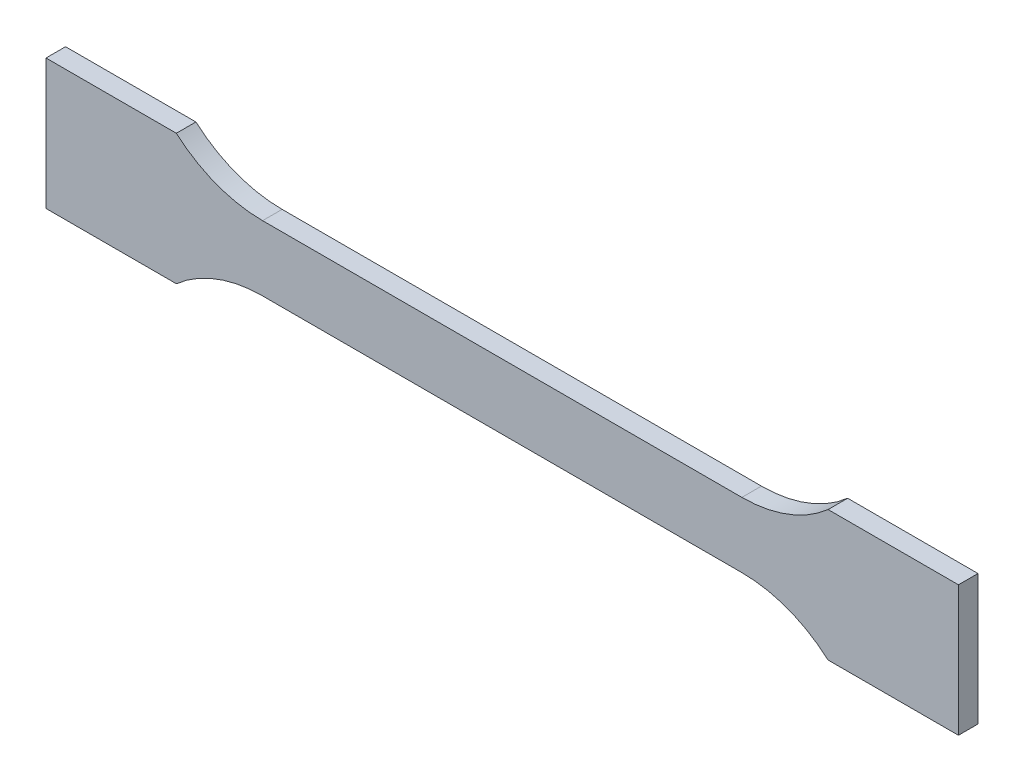
ISO-10303-21;
HEADER;
FILE_DESCRIPTION(('STEP AP214'),'2;1');
FILE_NAME('part.step','',(''),(''),'','','');
FILE_SCHEMA(('AUTOMOTIVE_DESIGN { 1 0 10303 214 1 1 1 1 }'));
ENDSEC;
DATA;
#1=APPLICATION_CONTEXT('core data for automotive mechanical design processes');
#2=APPLICATION_PROTOCOL_DEFINITION('international standard','automotive_design',2000,#1);
#3=PRODUCT_CONTEXT('',#1,'mechanical');
#4=PRODUCT('Part','Part','',(#3));
#5=PRODUCT_RELATED_PRODUCT_CATEGORY('part','',(#4));
#6=PRODUCT_DEFINITION_FORMATION('','',#4);
#7=PRODUCT_DEFINITION_CONTEXT('part definition',#1,'design');
#8=PRODUCT_DEFINITION('design','',#6,#7);
#9=PRODUCT_DEFINITION_SHAPE('','',#8);
#10=(LENGTH_UNIT() NAMED_UNIT(*) SI_UNIT(.MILLI.,.METRE.));
#11=(NAMED_UNIT(*) PLANE_ANGLE_UNIT() SI_UNIT($,.RADIAN.));
#12=(NAMED_UNIT(*) SI_UNIT($,.STERADIAN.) SOLID_ANGLE_UNIT());
#13=UNCERTAINTY_MEASURE_WITH_UNIT(LENGTH_MEASURE(1.E-05),#10,'distance_accuracy_value','');
#14=(GEOMETRIC_REPRESENTATION_CONTEXT(3) GLOBAL_UNCERTAINTY_ASSIGNED_CONTEXT((#13)) GLOBAL_UNIT_ASSIGNED_CONTEXT((#10,
#11,#12)) REPRESENTATION_CONTEXT('',''));
#15=CARTESIAN_POINT('',(0.,0.,0.));
#16=DIRECTION('',(0.,0.,1.));
#17=DIRECTION('',(1.,0.,0.));
#18=AXIS2_PLACEMENT_3D('',#15,#16,#17);
#19=CARTESIAN_POINT('',(0.,0.,3.));
#20=DIRECTION('',(0.,1.,0.));
#21=DIRECTION('',(0.,0.,1.));
#22=AXIS2_PLACEMENT_3D('',#19,#20,#21);
#23=PLANE('',#22);
#24=DIRECTION('',(1.,0.,0.));
#25=VECTOR('',#24,1.);
#26=CARTESIAN_POINT('',(0.,0.,0.));
#27=LINE('',#26,#25);
#28=CARTESIAN_POINT('',(0.,0.,0.));
#29=VERTEX_POINT('',#28);
#30=CARTESIAN_POINT('',(20.,0.,0.));
#31=VERTEX_POINT('',#30);
#32=EDGE_CURVE('E122',#29,#31,#27,.T.);
#33=ORIENTED_EDGE('',*,*,#32,.T.);
#34=DIRECTION('',(0.,0.,-1.));
#35=VECTOR('',#34,1.);
#36=CARTESIAN_POINT('',(20.,0.,3.));
#37=LINE('',#36,#35);
#38=CARTESIAN_POINT('',(20.,0.,3.));
#39=VERTEX_POINT('',#38);
#40=EDGE_CURVE('E11',#39,#31,#37,.T.);
#41=ORIENTED_EDGE('',*,*,#40,.F.);
#42=DIRECTION('',(1.,0.,0.));
#43=VECTOR('',#42,1.);
#44=CARTESIAN_POINT('',(0.,0.,3.));
#45=LINE('',#44,#43);
#46=CARTESIAN_POINT('',(0.,0.,3.));
#47=VERTEX_POINT('',#46);
#48=EDGE_CURVE('E136',#47,#39,#45,.T.);
#49=ORIENTED_EDGE('',*,*,#48,.F.);
#50=DIRECTION('',(0.,0.,-1.));
#51=VECTOR('',#50,1.);
#52=CARTESIAN_POINT('',(0.,0.,3.));
#53=LINE('',#52,#51);
#54=EDGE_CURVE('E118',#47,#29,#53,.T.);
#55=ORIENTED_EDGE('',*,*,#54,.T.);
#56=EDGE_LOOP('',(#33,#41,#49,#55));
#57=FACE_BOUND('',#56,.T.);
#58=ADVANCED_FACE('F33',(#57),#23,.F.);
#59=CARTESIAN_POINT('',(33.228756555323,-15.,3.));
#60=DIRECTION('',(0.,0.,-1.));
#61=DIRECTION('',(-1.,0.,0.));
#62=AXIS2_PLACEMENT_3D('',#59,#60,#61);
#63=CYLINDRICAL_SURFACE('',#62,20.);
#64=CARTESIAN_POINT('',(33.228756555323,-15.,0.));
#65=DIRECTION('',(0.,0.,-1.));
#66=DIRECTION('',(-1.,0.,0.));
#67=AXIS2_PLACEMENT_3D('',#64,#65,#66);
#68=CIRCLE('',#67,20.);
#69=CARTESIAN_POINT('',(33.228756555323,5.,0.));
#70=VERTEX_POINT('',#69);
#71=EDGE_CURVE('E125',#31,#70,#68,.T.);
#72=ORIENTED_EDGE('',*,*,#71,.T.);
#73=DIRECTION('',(0.,0.,-1.));
#74=VECTOR('',#73,1.);
#75=CARTESIAN_POINT('',(33.228756555323,5.,3.));
#76=LINE('',#75,#74);
#77=CARTESIAN_POINT('',(33.228756555323,5.,3.));
#78=VERTEX_POINT('',#77);
#79=EDGE_CURVE('E41',#78,#70,#76,.T.);
#80=ORIENTED_EDGE('',*,*,#79,.F.);
#81=CARTESIAN_POINT('',(33.228756555323,-15.,3.));
#82=DIRECTION('',(0.,0.,-1.));
#83=DIRECTION('',(-1.,0.,0.));
#84=AXIS2_PLACEMENT_3D('',#81,#82,#83);
#85=CIRCLE('',#84,20.);
#86=EDGE_CURVE('E87',#39,#78,#85,.T.);
#87=ORIENTED_EDGE('',*,*,#86,.F.);
#88=ORIENTED_EDGE('',*,*,#40,.T.);
#89=EDGE_LOOP('',(#72,#80,#87,#88));
#90=FACE_BOUND('',#89,.T.);
#91=ADVANCED_FACE('F261',(#90),#63,.F.);
#92=CARTESIAN_POINT('',(33.228756555323,5.,3.));
#93=DIRECTION('',(0.,1.,0.));
#94=DIRECTION('',(-1.,0.,0.));
#95=AXIS2_PLACEMENT_3D('',#92,#93,#94);
#96=PLANE('',#95);
#97=DIRECTION('',(1.,0.,0.));
#98=VECTOR('',#97,1.);
#99=CARTESIAN_POINT('',(33.228756555323,5.,0.));
#100=LINE('',#99,#98);
#101=CARTESIAN_POINT('',(106.771243444677,5.,0.));
#102=VERTEX_POINT('',#101);
#103=EDGE_CURVE('E128',#70,#102,#100,.T.);
#104=ORIENTED_EDGE('',*,*,#103,.T.);
#105=DIRECTION('',(0.,0.,-1.));
#106=VECTOR('',#105,1.);
#107=CARTESIAN_POINT('',(106.771243444677,5.,3.));
#108=LINE('',#107,#106);
#109=CARTESIAN_POINT('',(106.771243444677,5.,3.));
#110=VERTEX_POINT('',#109);
#111=EDGE_CURVE('E176',#110,#102,#108,.T.);
#112=ORIENTED_EDGE('',*,*,#111,.F.);
#113=DIRECTION('',(1.,0.,0.));
#114=VECTOR('',#113,1.);
#115=CARTESIAN_POINT('',(33.228756555323,5.,3.));
#116=LINE('',#115,#114);
#117=EDGE_CURVE('E148',#78,#110,#116,.T.);
#118=ORIENTED_EDGE('',*,*,#117,.F.);
#119=ORIENTED_EDGE('',*,*,#79,.T.);
#120=EDGE_LOOP('',(#104,#112,#118,#119));
#121=FACE_BOUND('',#120,.T.);
#122=ADVANCED_FACE('F143',(#121),#96,.F.);
#123=CARTESIAN_POINT('',(33.228756555323,15.,3.));
#124=DIRECTION('',(0.,-1.,0.));
#125=DIRECTION('',(0.,0.,-1.));
#126=AXIS2_PLACEMENT_3D('',#123,#124,#125);
#127=PLANE('',#126);
#128=DIRECTION('',(-1.,0.,0.));
#129=VECTOR('',#128,1.);
#130=CARTESIAN_POINT('',(33.228756555323,15.,0.));
#131=LINE('',#130,#129);
#132=CARTESIAN_POINT('',(106.771243444677,15.,0.));
#133=VERTEX_POINT('',#132);
#134=CARTESIAN_POINT('',(33.2287565553229,15.,0.));
#135=VERTEX_POINT('',#134);
#136=EDGE_CURVE('E131',#133,#135,#131,.T.);
#137=ORIENTED_EDGE('',*,*,#136,.T.);
#138=DIRECTION('',(0.,0.,-1.));
#139=VECTOR('',#138,1.);
#140=CARTESIAN_POINT('',(33.2287565553229,15.,3.));
#141=LINE('',#140,#139);
#142=CARTESIAN_POINT('',(33.2287565553229,15.,3.));
#143=VERTEX_POINT('',#142);
#144=EDGE_CURVE('E113',#143,#135,#141,.T.);
#145=ORIENTED_EDGE('',*,*,#144,.F.);
#146=DIRECTION('',(-1.,0.,0.));
#147=VECTOR('',#146,1.);
#148=CARTESIAN_POINT('',(33.228756555323,15.,3.));
#149=LINE('',#148,#147);
#150=CARTESIAN_POINT('',(106.771243444677,15.,3.));
#151=VERTEX_POINT('',#150);
#152=EDGE_CURVE('E104',#151,#143,#149,.T.);
#153=ORIENTED_EDGE('',*,*,#152,.F.);
#154=DIRECTION('',(0.,0.,-1.));
#155=VECTOR('',#154,1.);
#156=CARTESIAN_POINT('',(106.771243444677,15.,3.));
#157=LINE('',#156,#155);
#158=EDGE_CURVE('E179',#151,#133,#157,.T.);
#159=ORIENTED_EDGE('',*,*,#158,.T.);
#160=EDGE_LOOP('',(#137,#145,#153,#159));
#161=FACE_BOUND('',#160,.T.);
#162=ADVANCED_FACE('F246',(#161),#127,.F.);
#163=CARTESIAN_POINT('',(33.228756555323,35.,3.));
#164=DIRECTION('',(0.,0.,-1.));
#165=DIRECTION('',(-1.,0.,0.));
#166=AXIS2_PLACEMENT_3D('',#163,#164,#165);
#167=CYLINDRICAL_SURFACE('',#166,20.);
#168=CARTESIAN_POINT('',(33.228756555323,35.,0.));
#169=DIRECTION('',(0.,0.,-1.));
#170=DIRECTION('',(1.,0.,0.));
#171=AXIS2_PLACEMENT_3D('',#168,#169,#170);
#172=CIRCLE('',#171,20.);
#173=CARTESIAN_POINT('',(20.,20.,0.));
#174=VERTEX_POINT('',#173);
#175=EDGE_CURVE('E112',#135,#174,#172,.T.);
#176=ORIENTED_EDGE('',*,*,#175,.T.);
#177=DIRECTION('',(0.,0.,-1.));
#178=VECTOR('',#177,1.);
#179=CARTESIAN_POINT('',(20.,20.,3.));
#180=LINE('',#179,#178);
#181=CARTESIAN_POINT('',(20.,20.,3.));
#182=VERTEX_POINT('',#181);
#183=EDGE_CURVE('E109',#182,#174,#180,.T.);
#184=ORIENTED_EDGE('',*,*,#183,.F.);
#185=CARTESIAN_POINT('',(33.228756555323,35.,3.));
#186=DIRECTION('',(0.,0.,-1.));
#187=DIRECTION('',(1.,0.,0.));
#188=AXIS2_PLACEMENT_3D('',#185,#186,#187);
#189=CIRCLE('',#188,20.);
#190=EDGE_CURVE('E97',#143,#182,#189,.T.);
#191=ORIENTED_EDGE('',*,*,#190,.F.);
#192=ORIENTED_EDGE('',*,*,#144,.T.);
#193=EDGE_LOOP('',(#176,#184,#191,#192));
#194=FACE_BOUND('',#193,.T.);
#195=ADVANCED_FACE('F110',(#194),#167,.F.);
#196=CARTESIAN_POINT('',(0.,20.,3.));
#197=DIRECTION('',(0.,-1.,0.));
#198=DIRECTION('',(0.,0.,-1.));
#199=AXIS2_PLACEMENT_3D('',#196,#197,#198);
#200=PLANE('',#199);
#201=DIRECTION('',(-1.,0.,0.));
#202=VECTOR('',#201,1.);
#203=CARTESIAN_POINT('',(0.,20.,0.));
#204=LINE('',#203,#202);
#205=CARTESIAN_POINT('',(0.,20.,0.));
#206=VERTEX_POINT('',#205);
#207=EDGE_CURVE('E73',#174,#206,#204,.T.);
#208=ORIENTED_EDGE('',*,*,#207,.T.);
#209=DIRECTION('',(0.,0.,-1.));
#210=VECTOR('',#209,1.);
#211=CARTESIAN_POINT('',(0.,20.,3.));
#212=LINE('',#211,#210);
#213=CARTESIAN_POINT('',(0.,20.,3.));
#214=VERTEX_POINT('',#213);
#215=EDGE_CURVE('E114',#214,#206,#212,.T.);
#216=ORIENTED_EDGE('',*,*,#215,.F.);
#217=DIRECTION('',(-1.,0.,0.));
#218=VECTOR('',#217,1.);
#219=CARTESIAN_POINT('',(0.,20.,3.));
#220=LINE('',#219,#218);
#221=EDGE_CURVE('E101',#182,#214,#220,.T.);
#222=ORIENTED_EDGE('',*,*,#221,.F.);
#223=ORIENTED_EDGE('',*,*,#183,.T.);
#224=EDGE_LOOP('',(#208,#216,#222,#223));
#225=FACE_BOUND('',#224,.T.);
#226=ADVANCED_FACE('F116',(#225),#200,.F.);
#227=CARTESIAN_POINT('',(0.,20.,3.));
#228=DIRECTION('',(1.,0.,0.));
#229=DIRECTION('',(0.,0.,-1.));
#230=AXIS2_PLACEMENT_3D('',#227,#228,#229);
#231=PLANE('',#230);
#232=DIRECTION('',(0.,-1.,0.));
#233=VECTOR('',#232,1.);
#234=CARTESIAN_POINT('',(0.,20.,0.));
#235=LINE('',#234,#233);
#236=EDGE_CURVE('E79',#206,#29,#235,.T.);
#237=ORIENTED_EDGE('',*,*,#236,.T.);
#238=ORIENTED_EDGE('',*,*,#54,.F.);
#239=DIRECTION('',(0.,-1.,0.));
#240=VECTOR('',#239,1.);
#241=CARTESIAN_POINT('',(0.,20.,3.));
#242=LINE('',#241,#240);
#243=EDGE_CURVE('E49',#214,#47,#242,.T.);
#244=ORIENTED_EDGE('',*,*,#243,.F.);
#245=ORIENTED_EDGE('',*,*,#215,.T.);
#246=EDGE_LOOP('',(#237,#238,#244,#245));
#247=FACE_BOUND('',#246,.T.);
#248=ADVANCED_FACE('F250',(#247),#231,.F.);
#249=CARTESIAN_POINT('',(33.228756555323,-15.,3.));
#250=DIRECTION('',(0.,0.,-1.));
#251=DIRECTION('',(-1.,0.,0.));
#252=AXIS2_PLACEMENT_3D('',#249,#250,#251);
#253=PLANE('',#252);
#254=ORIENTED_EDGE('',*,*,#48,.T.);
#255=ORIENTED_EDGE('',*,*,#86,.T.);
#256=ORIENTED_EDGE('',*,*,#117,.T.);
#257=CARTESIAN_POINT('',(106.771243444677,-15.,3.));
#258=DIRECTION('',(0.,0.,1.));
#259=DIRECTION('',(1.,0.,0.));
#260=AXIS2_PLACEMENT_3D('',#257,#258,#259);
#261=CIRCLE('',#260,20.);
#262=CARTESIAN_POINT('',(120.,0.,3.));
#263=VERTEX_POINT('',#262);
#264=EDGE_CURVE('E177',#263,#110,#261,.T.);
#265=ORIENTED_EDGE('',*,*,#264,.F.);
#266=DIRECTION('',(-1.,0.,0.));
#267=VECTOR('',#266,1.);
#268=CARTESIAN_POINT('',(140.,0.,3.));
#269=LINE('',#268,#267);
#270=CARTESIAN_POINT('',(140.,0.,3.));
#271=VERTEX_POINT('',#270);
#272=EDGE_CURVE('E162',#271,#263,#269,.T.);
#273=ORIENTED_EDGE('',*,*,#272,.F.);
#274=DIRECTION('',(0.,-1.,0.));
#275=VECTOR('',#274,1.);
#276=CARTESIAN_POINT('',(140.,20.,3.));
#277=LINE('',#276,#275);
#278=CARTESIAN_POINT('',(140.,20.,3.));
#279=VERTEX_POINT('',#278);
#280=EDGE_CURVE('E166',#279,#271,#277,.T.);
#281=ORIENTED_EDGE('',*,*,#280,.F.);
#282=DIRECTION('',(1.,0.,0.));
#283=VECTOR('',#282,1.);
#284=CARTESIAN_POINT('',(140.,20.,3.));
#285=LINE('',#284,#283);
#286=CARTESIAN_POINT('',(120.,20.,3.));
#287=VERTEX_POINT('',#286);
#288=EDGE_CURVE('E202',#287,#279,#285,.T.);
#289=ORIENTED_EDGE('',*,*,#288,.F.);
#290=CARTESIAN_POINT('',(106.771243444677,35.,3.));
#291=DIRECTION('',(0.,0.,1.));
#292=DIRECTION('',(-1.,0.,0.));
#293=AXIS2_PLACEMENT_3D('',#290,#291,#292);
#294=CIRCLE('',#293,20.);
#295=EDGE_CURVE('E199',#151,#287,#294,.T.);
#296=ORIENTED_EDGE('',*,*,#295,.F.);
#297=ORIENTED_EDGE('',*,*,#152,.T.);
#298=ORIENTED_EDGE('',*,*,#190,.T.);
#299=ORIENTED_EDGE('',*,*,#221,.T.);
#300=ORIENTED_EDGE('',*,*,#243,.T.);
#301=EDGE_LOOP('',(#254,#255,#256,#265,#273,#281,#289,#296,#297,#298,#299,#300));
#302=FACE_BOUND('',#301,.T.);
#303=ADVANCED_FACE('F99',(#302),#253,.F.);
#304=CARTESIAN_POINT('',(33.228756555323,-15.,0.));
#305=DIRECTION('',(0.,0.,-1.));
#306=DIRECTION('',(-1.,0.,0.));
#307=AXIS2_PLACEMENT_3D('',#304,#305,#306);
#308=PLANE('',#307);
#309=ORIENTED_EDGE('',*,*,#32,.F.);
#310=ORIENTED_EDGE('',*,*,#236,.F.);
#311=ORIENTED_EDGE('',*,*,#207,.F.);
#312=ORIENTED_EDGE('',*,*,#175,.F.);
#313=ORIENTED_EDGE('',*,*,#136,.F.);
#314=CARTESIAN_POINT('',(106.771243444677,35.,0.));
#315=DIRECTION('',(0.,0.,1.));
#316=DIRECTION('',(-1.,0.,0.));
#317=AXIS2_PLACEMENT_3D('',#314,#315,#316);
#318=CIRCLE('',#317,20.);
#319=CARTESIAN_POINT('',(120.,20.,0.));
#320=VERTEX_POINT('',#319);
#321=EDGE_CURVE('E163',#133,#320,#318,.T.);
#322=ORIENTED_EDGE('',*,*,#321,.T.);
#323=DIRECTION('',(1.,0.,0.));
#324=VECTOR('',#323,1.);
#325=CARTESIAN_POINT('',(140.,20.,0.));
#326=LINE('',#325,#324);
#327=CARTESIAN_POINT('',(140.,20.,0.));
#328=VERTEX_POINT('',#327);
#329=EDGE_CURVE('E169',#320,#328,#326,.T.);
#330=ORIENTED_EDGE('',*,*,#329,.T.);
#331=DIRECTION('',(0.,-1.,0.));
#332=VECTOR('',#331,1.);
#333=CARTESIAN_POINT('',(140.,20.,0.));
#334=LINE('',#333,#332);
#335=CARTESIAN_POINT('',(140.,0.,0.));
#336=VERTEX_POINT('',#335);
#337=EDGE_CURVE('E207',#328,#336,#334,.T.);
#338=ORIENTED_EDGE('',*,*,#337,.T.);
#339=DIRECTION('',(-1.,0.,0.));
#340=VECTOR('',#339,1.);
#341=CARTESIAN_POINT('',(140.,0.,0.));
#342=LINE('',#341,#340);
#343=CARTESIAN_POINT('',(120.,0.,0.));
#344=VERTEX_POINT('',#343);
#345=EDGE_CURVE('E158',#336,#344,#342,.T.);
#346=ORIENTED_EDGE('',*,*,#345,.T.);
#347=CARTESIAN_POINT('',(106.771243444677,-15.,0.));
#348=DIRECTION('',(0.,0.,1.));
#349=DIRECTION('',(1.,0.,0.));
#350=AXIS2_PLACEMENT_3D('',#347,#348,#349);
#351=CIRCLE('',#350,20.);
#352=EDGE_CURVE('E155',#344,#102,#351,.T.);
#353=ORIENTED_EDGE('',*,*,#352,.T.);
#354=ORIENTED_EDGE('',*,*,#103,.F.);
#355=ORIENTED_EDGE('',*,*,#71,.F.);
#356=EDGE_LOOP('',(#309,#310,#311,#312,#313,#322,#330,#338,#346,#353,#354,#355));
#357=FACE_BOUND('',#356,.T.);
#358=ADVANCED_FACE('F152',(#357),#308,.T.);
#359=CARTESIAN_POINT('',(140.,0.,3.));
#360=DIRECTION('',(0.,-1.,0.));
#361=DIRECTION('',(0.,0.,-1.));
#362=AXIS2_PLACEMENT_3D('',#359,#360,#361);
#363=PLANE('',#362);
#364=ORIENTED_EDGE('',*,*,#345,.F.);
#365=DIRECTION('',(0.,0.,-1.));
#366=VECTOR('',#365,1.);
#367=CARTESIAN_POINT('',(140.,0.,3.));
#368=LINE('',#367,#366);
#369=EDGE_CURVE('E126',#271,#336,#368,.T.);
#370=ORIENTED_EDGE('',*,*,#369,.F.);
#371=ORIENTED_EDGE('',*,*,#272,.T.);
#372=DIRECTION('',(0.,0.,-1.));
#373=VECTOR('',#372,1.);
#374=CARTESIAN_POINT('',(120.,0.,3.));
#375=LINE('',#374,#373);
#376=EDGE_CURVE('E173',#263,#344,#375,.T.);
#377=ORIENTED_EDGE('',*,*,#376,.T.);
#378=EDGE_LOOP('',(#364,#370,#371,#377));
#379=FACE_BOUND('',#378,.T.);
#380=ADVANCED_FACE('F237',(#379),#363,.T.);
#381=CARTESIAN_POINT('',(140.,20.,3.));
#382=DIRECTION('',(1.,0.,0.));
#383=DIRECTION('',(0.,0.,-1.));
#384=AXIS2_PLACEMENT_3D('',#381,#382,#383);
#385=PLANE('',#384);
#386=ORIENTED_EDGE('',*,*,#337,.F.);
#387=DIRECTION('',(0.,0.,-1.));
#388=VECTOR('',#387,1.);
#389=CARTESIAN_POINT('',(140.,20.,3.));
#390=LINE('',#389,#388);
#391=EDGE_CURVE('E185',#279,#328,#390,.T.);
#392=ORIENTED_EDGE('',*,*,#391,.F.);
#393=ORIENTED_EDGE('',*,*,#280,.T.);
#394=ORIENTED_EDGE('',*,*,#369,.T.);
#395=EDGE_LOOP('',(#386,#392,#393,#394));
#396=FACE_BOUND('',#395,.T.);
#397=ADVANCED_FACE('F241',(#396),#385,.T.);
#398=CARTESIAN_POINT('',(140.,20.,3.));
#399=DIRECTION('',(0.,1.,0.));
#400=DIRECTION('',(0.,0.,1.));
#401=AXIS2_PLACEMENT_3D('',#398,#399,#400);
#402=PLANE('',#401);
#403=ORIENTED_EDGE('',*,*,#329,.F.);
#404=DIRECTION('',(0.,0.,-1.));
#405=VECTOR('',#404,1.);
#406=CARTESIAN_POINT('',(120.,20.,3.));
#407=LINE('',#406,#405);
#408=EDGE_CURVE('E182',#287,#320,#407,.T.);
#409=ORIENTED_EDGE('',*,*,#408,.F.);
#410=ORIENTED_EDGE('',*,*,#288,.T.);
#411=ORIENTED_EDGE('',*,*,#391,.T.);
#412=EDGE_LOOP('',(#403,#409,#410,#411));
#413=FACE_BOUND('',#412,.T.);
#414=ADVANCED_FACE('F219',(#413),#402,.T.);
#415=CARTESIAN_POINT('',(106.771243444677,35.,3.));
#416=DIRECTION('',(0.,0.,-1.));
#417=DIRECTION('',(-1.,0.,0.));
#418=AXIS2_PLACEMENT_3D('',#415,#416,#417);
#419=CYLINDRICAL_SURFACE('',#418,20.);
#420=ORIENTED_EDGE('',*,*,#321,.F.);
#421=ORIENTED_EDGE('',*,*,#158,.F.);
#422=ORIENTED_EDGE('',*,*,#295,.T.);
#423=ORIENTED_EDGE('',*,*,#408,.T.);
#424=EDGE_LOOP('',(#420,#421,#422,#423));
#425=FACE_BOUND('',#424,.T.);
#426=ADVANCED_FACE('F244',(#425),#419,.F.);
#427=CARTESIAN_POINT('',(106.771243444677,-15.,3.));
#428=DIRECTION('',(0.,0.,-1.));
#429=DIRECTION('',(-1.,0.,0.));
#430=AXIS2_PLACEMENT_3D('',#427,#428,#429);
#431=CYLINDRICAL_SURFACE('',#430,20.);
#432=ORIENTED_EDGE('',*,*,#352,.F.);
#433=ORIENTED_EDGE('',*,*,#376,.F.);
#434=ORIENTED_EDGE('',*,*,#264,.T.);
#435=ORIENTED_EDGE('',*,*,#111,.T.);
#436=EDGE_LOOP('',(#432,#433,#434,#435));
#437=FACE_BOUND('',#436,.T.);
#438=ADVANCED_FACE('F198',(#437),#431,.F.);
#439=CLOSED_SHELL('',(#58,#91,#122,#162,#195,#226,#248,#303,#358,#380,#397,#414,#426,#438));
#440=MANIFOLD_SOLID_BREP('B2',#439);
#441=ADVANCED_BREP_SHAPE_REPRESENTATION('',(#18,#440),#14);
#442=SHAPE_DEFINITION_REPRESENTATION(#9,#441);
ENDSEC;
END-ISO-10303-21;
